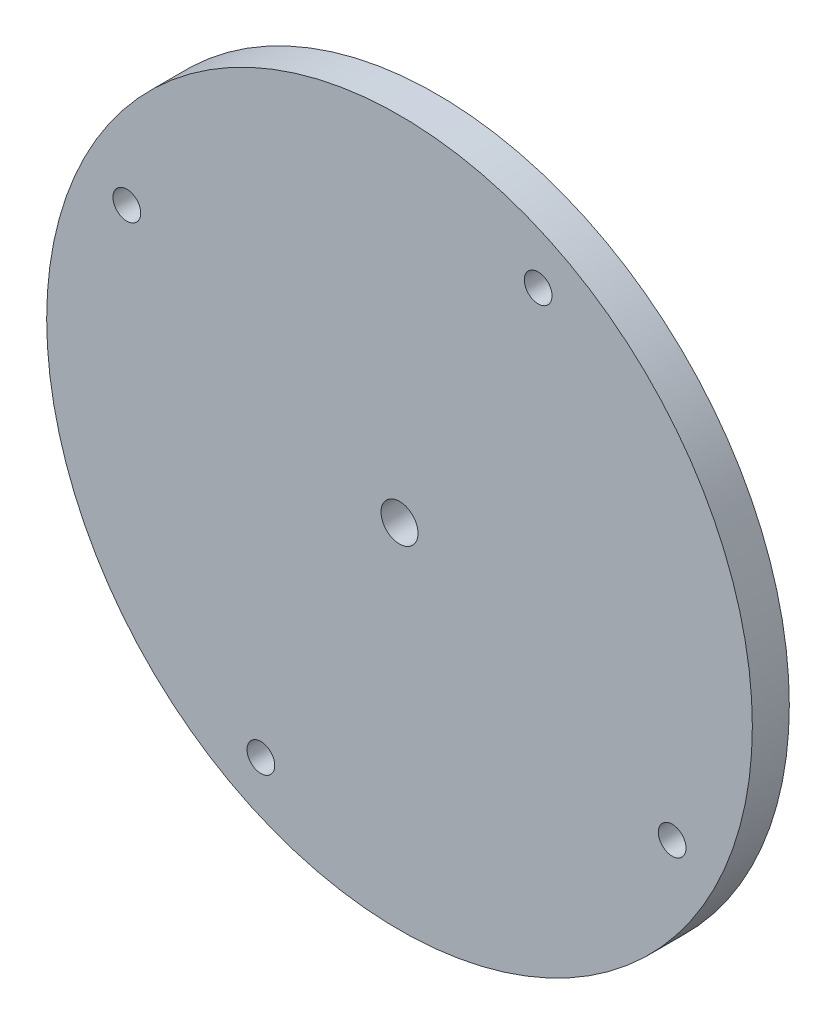
ISO-10303-21;
HEADER;
FILE_DESCRIPTION(('STEP AP214'),'2;1');
FILE_NAME('part.step','',(''),(''),'','','');
FILE_SCHEMA(('AUTOMOTIVE_DESIGN { 1 0 10303 214 1 1 1 1 }'));
ENDSEC;
DATA;
#1=APPLICATION_CONTEXT('core data for automotive mechanical design processes');
#2=APPLICATION_PROTOCOL_DEFINITION('international standard','automotive_design',2000,#1);
#3=PRODUCT_CONTEXT('',#1,'mechanical');
#4=PRODUCT('Part','Part','',(#3));
#5=PRODUCT_RELATED_PRODUCT_CATEGORY('part','',(#4));
#6=PRODUCT_DEFINITION_FORMATION('','',#4);
#7=PRODUCT_DEFINITION_CONTEXT('part definition',#1,'design');
#8=PRODUCT_DEFINITION('design','',#6,#7);
#9=PRODUCT_DEFINITION_SHAPE('','',#8);
#10=(LENGTH_UNIT() NAMED_UNIT(*) SI_UNIT(.MILLI.,.METRE.));
#11=(NAMED_UNIT(*) PLANE_ANGLE_UNIT() SI_UNIT($,.RADIAN.));
#12=(NAMED_UNIT(*) SI_UNIT($,.STERADIAN.) SOLID_ANGLE_UNIT());
#13=UNCERTAINTY_MEASURE_WITH_UNIT(LENGTH_MEASURE(1.E-05),#10,'distance_accuracy_value','');
#14=(GEOMETRIC_REPRESENTATION_CONTEXT(3) GLOBAL_UNCERTAINTY_ASSIGNED_CONTEXT((#13)) GLOBAL_UNIT_ASSIGNED_CONTEXT((#10,
#11,#12)) REPRESENTATION_CONTEXT('',''));
#15=CARTESIAN_POINT('',(0.,0.,0.));
#16=DIRECTION('',(0.,0.,1.));
#17=DIRECTION('',(1.,0.,0.));
#18=AXIS2_PLACEMENT_3D('',#15,#16,#17);
#19=CARTESIAN_POINT('',(-58.9999999999992,29.9999999999995,8.));
#20=DIRECTION('',(0.,0.,-1.));
#21=DIRECTION('',(-1.,0.,0.));
#22=AXIS2_PLACEMENT_3D('',#19,#20,#21);
#23=CYLINDRICAL_SURFACE('',#22,3.);
#24=CARTESIAN_POINT('',(-58.9999999999992,29.9999999999995,8.));
#25=DIRECTION('',(0.,0.,1.));
#26=DIRECTION('',(1.,0.,0.));
#27=AXIS2_PLACEMENT_3D('',#24,#25,#26);
#28=CIRCLE('',#27,3.);
#29=CARTESIAN_POINT('',(-55.9999999999992,29.9999999999995,8.));
#30=VERTEX_POINT('',#29);
#31=EDGE_CURVE('E45',#30,#30,#28,.T.);
#32=ORIENTED_EDGE('',*,*,#31,.T.);
#33=EDGE_LOOP('',(#32));
#34=FACE_BOUND('',#33,.T.);
#35=CARTESIAN_POINT('',(-58.9999999999992,29.9999999999995,0.));
#36=DIRECTION('',(0.,0.,1.));
#37=DIRECTION('',(1.,0.,0.));
#38=AXIS2_PLACEMENT_3D('',#35,#36,#37);
#39=CIRCLE('',#38,3.);
#40=CARTESIAN_POINT('',(-55.9999999999992,29.9999999999995,0.));
#41=VERTEX_POINT('',#40);
#42=EDGE_CURVE('E63',#41,#41,#39,.T.);
#43=ORIENTED_EDGE('',*,*,#42,.F.);
#44=EDGE_LOOP('',(#43));
#45=FACE_BOUND('',#44,.T.);
#46=ADVANCED_FACE('F37',(#34,#45),#23,.F.);
#47=CARTESIAN_POINT('',(59.,-30.0000000000005,8.));
#48=DIRECTION('',(0.,0.,-1.));
#49=DIRECTION('',(-1.,0.,0.));
#50=AXIS2_PLACEMENT_3D('',#47,#48,#49);
#51=CYLINDRICAL_SURFACE('',#50,3.00000000000001);
#52=CARTESIAN_POINT('',(59.,-30.0000000000005,8.));
#53=DIRECTION('',(0.,0.,1.));
#54=DIRECTION('',(1.,0.,0.));
#55=AXIS2_PLACEMENT_3D('',#52,#53,#54);
#56=CIRCLE('',#55,3.00000000000001);
#57=CARTESIAN_POINT('',(62.,-30.0000000000005,8.));
#58=VERTEX_POINT('',#57);
#59=EDGE_CURVE('E50',#58,#58,#56,.T.);
#60=ORIENTED_EDGE('',*,*,#59,.T.);
#61=EDGE_LOOP('',(#60));
#62=FACE_BOUND('',#61,.T.);
#63=CARTESIAN_POINT('',(59.,-30.0000000000005,0.));
#64=DIRECTION('',(0.,0.,1.));
#65=DIRECTION('',(1.,0.,0.));
#66=AXIS2_PLACEMENT_3D('',#63,#64,#65);
#67=CIRCLE('',#66,3.00000000000001);
#68=CARTESIAN_POINT('',(62.,-30.0000000000005,0.));
#69=VERTEX_POINT('',#68);
#70=EDGE_CURVE('E61',#69,#69,#67,.T.);
#71=ORIENTED_EDGE('',*,*,#70,.F.);
#72=EDGE_LOOP('',(#71));
#73=FACE_BOUND('',#72,.T.);
#74=ADVANCED_FACE('F84',(#62,#73),#51,.F.);
#75=CARTESIAN_POINT('',(-29.9999999999992,-59.,8.));
#76=DIRECTION('',(0.,0.,-1.));
#77=DIRECTION('',(-1.,0.,0.));
#78=AXIS2_PLACEMENT_3D('',#75,#76,#77);
#79=CYLINDRICAL_SURFACE('',#78,3.);
#80=CARTESIAN_POINT('',(-29.9999999999992,-59.,8.));
#81=DIRECTION('',(0.,0.,1.));
#82=DIRECTION('',(1.,0.,0.));
#83=AXIS2_PLACEMENT_3D('',#80,#81,#82);
#84=CIRCLE('',#83,3.);
#85=CARTESIAN_POINT('',(-26.9999999999992,-59.,8.));
#86=VERTEX_POINT('',#85);
#87=EDGE_CURVE('E72',#86,#86,#84,.T.);
#88=ORIENTED_EDGE('',*,*,#87,.T.);
#89=EDGE_LOOP('',(#88));
#90=FACE_BOUND('',#89,.T.);
#91=CARTESIAN_POINT('',(-29.9999999999992,-59.,0.));
#92=DIRECTION('',(0.,0.,1.));
#93=DIRECTION('',(1.,0.,0.));
#94=AXIS2_PLACEMENT_3D('',#91,#92,#93);
#95=CIRCLE('',#94,3.);
#96=CARTESIAN_POINT('',(-26.9999999999992,-59.,0.));
#97=VERTEX_POINT('',#96);
#98=EDGE_CURVE('E57',#97,#97,#95,.T.);
#99=ORIENTED_EDGE('',*,*,#98,.F.);
#100=EDGE_LOOP('',(#99));
#101=FACE_BOUND('',#100,.T.);
#102=ADVANCED_FACE('F103',(#90,#101),#79,.F.);
#103=CARTESIAN_POINT('',(0.,0.,8.));
#104=DIRECTION('',(0.,0.,-1.));
#105=DIRECTION('',(-1.,0.,0.));
#106=AXIS2_PLACEMENT_3D('',#103,#104,#105);
#107=CYLINDRICAL_SURFACE('',#106,76.35);
#108=CARTESIAN_POINT('',(0.,0.,8.));
#109=DIRECTION('',(0.,0.,1.));
#110=DIRECTION('',(1.,0.,0.));
#111=AXIS2_PLACEMENT_3D('',#108,#109,#110);
#112=CIRCLE('',#111,76.35);
#113=CARTESIAN_POINT('',(76.35,0.,8.));
#114=VERTEX_POINT('',#113);
#115=EDGE_CURVE('E68',#114,#114,#112,.T.);
#116=ORIENTED_EDGE('',*,*,#115,.F.);
#117=EDGE_LOOP('',(#116));
#118=FACE_BOUND('',#117,.T.);
#119=CARTESIAN_POINT('',(0.,0.,0.));
#120=DIRECTION('',(0.,0.,1.));
#121=DIRECTION('',(1.,0.,0.));
#122=AXIS2_PLACEMENT_3D('',#119,#120,#121);
#123=CIRCLE('',#122,76.35);
#124=CARTESIAN_POINT('',(76.35,0.,0.));
#125=VERTEX_POINT('',#124);
#126=EDGE_CURVE('E54',#125,#125,#123,.T.);
#127=ORIENTED_EDGE('',*,*,#126,.T.);
#128=EDGE_LOOP('',(#127));
#129=FACE_BOUND('',#128,.T.);
#130=ADVANCED_FACE('F39',(#118,#129),#107,.T.);
#131=CARTESIAN_POINT('',(30.0000000000008,59.,8.));
#132=DIRECTION('',(0.,0.,-1.));
#133=DIRECTION('',(-1.,0.,0.));
#134=AXIS2_PLACEMENT_3D('',#131,#132,#133);
#135=CYLINDRICAL_SURFACE('',#134,3.);
#136=CARTESIAN_POINT('',(30.0000000000008,59.,8.));
#137=DIRECTION('',(0.,0.,1.));
#138=DIRECTION('',(1.,0.,0.));
#139=AXIS2_PLACEMENT_3D('',#136,#137,#138);
#140=CIRCLE('',#139,3.);
#141=CARTESIAN_POINT('',(33.0000000000008,59.,8.));
#142=VERTEX_POINT('',#141);
#143=EDGE_CURVE('E10',#142,#142,#140,.T.);
#144=ORIENTED_EDGE('',*,*,#143,.T.);
#145=EDGE_LOOP('',(#144));
#146=FACE_BOUND('',#145,.T.);
#147=CARTESIAN_POINT('',(30.0000000000008,59.,0.));
#148=DIRECTION('',(0.,0.,1.));
#149=DIRECTION('',(1.,0.,0.));
#150=AXIS2_PLACEMENT_3D('',#147,#148,#149);
#151=CIRCLE('',#150,3.);
#152=CARTESIAN_POINT('',(33.0000000000008,59.,0.));
#153=VERTEX_POINT('',#152);
#154=EDGE_CURVE('E41',#153,#153,#151,.T.);
#155=ORIENTED_EDGE('',*,*,#154,.F.);
#156=EDGE_LOOP('',(#155));
#157=FACE_BOUND('',#156,.T.);
#158=ADVANCED_FACE('F91',(#146,#157),#135,.F.);
#159=CARTESIAN_POINT('',(0.,0.,8.));
#160=DIRECTION('',(0.,0.,1.));
#161=DIRECTION('',(1.,0.,0.));
#162=AXIS2_PLACEMENT_3D('',#159,#160,#161);
#163=PLANE('',#162);
#164=CARTESIAN_POINT('',(0.,0.,8.));
#165=DIRECTION('',(0.,0.,1.));
#166=DIRECTION('',(1.,0.,0.));
#167=AXIS2_PLACEMENT_3D('',#164,#165,#166);
#168=CIRCLE('',#167,4.);
#169=CARTESIAN_POINT('',(4.,0.,8.));
#170=VERTEX_POINT('',#169);
#171=EDGE_CURVE('E79',#170,#170,#168,.T.);
#172=ORIENTED_EDGE('',*,*,#171,.F.);
#173=EDGE_LOOP('',(#172));
#174=FACE_BOUND('',#173,.T.);
#175=ORIENTED_EDGE('',*,*,#115,.T.);
#176=EDGE_LOOP('',(#175));
#177=FACE_BOUND('',#176,.T.);
#178=ORIENTED_EDGE('',*,*,#87,.F.);
#179=EDGE_LOOP('',(#178));
#180=FACE_BOUND('',#179,.T.);
#181=ORIENTED_EDGE('',*,*,#59,.F.);
#182=EDGE_LOOP('',(#181));
#183=FACE_BOUND('',#182,.T.);
#184=ORIENTED_EDGE('',*,*,#31,.F.);
#185=EDGE_LOOP('',(#184));
#186=FACE_BOUND('',#185,.T.);
#187=ORIENTED_EDGE('',*,*,#143,.F.);
#188=EDGE_LOOP('',(#187));
#189=FACE_BOUND('',#188,.T.);
#190=ADVANCED_FACE('F87',(#174,#177,#180,#183,#186,#189),#163,.T.);
#191=CARTESIAN_POINT('',(0.,0.,0.));
#192=DIRECTION('',(0.,0.,1.));
#193=DIRECTION('',(1.,0.,0.));
#194=AXIS2_PLACEMENT_3D('',#191,#192,#193);
#195=PLANE('',#194);
#196=CARTESIAN_POINT('',(0.,0.,0.));
#197=DIRECTION('',(0.,0.,1.));
#198=DIRECTION('',(1.,0.,0.));
#199=AXIS2_PLACEMENT_3D('',#196,#197,#198);
#200=CIRCLE('',#199,4.);
#201=CARTESIAN_POINT('',(4.,0.,0.));
#202=VERTEX_POINT('',#201);
#203=EDGE_CURVE('E58',#202,#202,#200,.T.);
#204=ORIENTED_EDGE('',*,*,#203,.T.);
#205=EDGE_LOOP('',(#204));
#206=FACE_BOUND('',#205,.T.);
#207=ORIENTED_EDGE('',*,*,#126,.F.);
#208=EDGE_LOOP('',(#207));
#209=FACE_BOUND('',#208,.T.);
#210=ORIENTED_EDGE('',*,*,#98,.T.);
#211=EDGE_LOOP('',(#210));
#212=FACE_BOUND('',#211,.T.);
#213=ORIENTED_EDGE('',*,*,#70,.T.);
#214=EDGE_LOOP('',(#213));
#215=FACE_BOUND('',#214,.T.);
#216=ORIENTED_EDGE('',*,*,#42,.T.);
#217=EDGE_LOOP('',(#216));
#218=FACE_BOUND('',#217,.T.);
#219=ORIENTED_EDGE('',*,*,#154,.T.);
#220=EDGE_LOOP('',(#219));
#221=FACE_BOUND('',#220,.T.);
#222=ADVANCED_FACE('F90',(#206,#209,#212,#215,#218,#221),#195,.F.);
#223=CARTESIAN_POINT('',(0.,0.,0.));
#224=DIRECTION('',(0.,0.,1.));
#225=DIRECTION('',(1.,0.,0.));
#226=AXIS2_PLACEMENT_3D('',#223,#224,#225);
#227=CYLINDRICAL_SURFACE('',#226,4.);
#228=ORIENTED_EDGE('',*,*,#203,.F.);
#229=EDGE_LOOP('',(#228));
#230=FACE_BOUND('',#229,.T.);
#231=ORIENTED_EDGE('',*,*,#171,.T.);
#232=EDGE_LOOP('',(#231));
#233=FACE_BOUND('',#232,.T.);
#234=ADVANCED_FACE('F119',(#230,#233),#227,.F.);
#235=CLOSED_SHELL('',(#46,#74,#102,#130,#158,#190,#222,#234));
#236=MANIFOLD_SOLID_BREP('B2',#235);
#237=ADVANCED_BREP_SHAPE_REPRESENTATION('',(#18,#236),#14);
#238=SHAPE_DEFINITION_REPRESENTATION(#9,#237);
ENDSEC;
END-ISO-10303-21;
